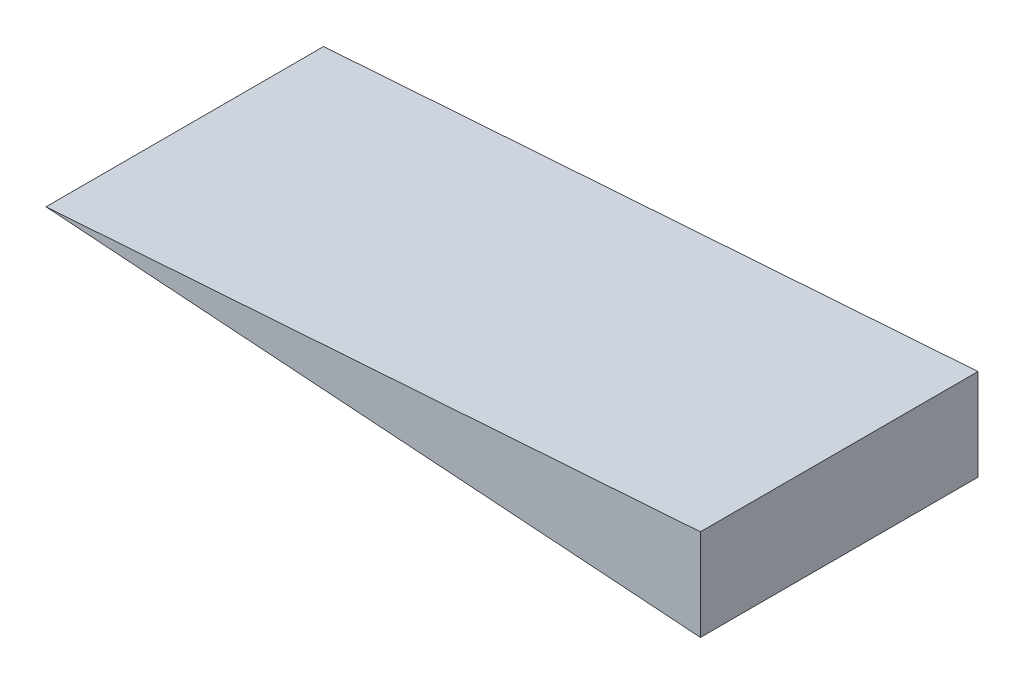
ISO-10303-21;
HEADER;
FILE_DESCRIPTION(('STEP AP214'),'2;1');
FILE_NAME('part.step','',(''),(''),'','','');
FILE_SCHEMA(('AUTOMOTIVE_DESIGN { 1 0 10303 214 1 1 1 1 }'));
ENDSEC;
DATA;
#1=APPLICATION_CONTEXT('core data for automotive mechanical design processes');
#2=APPLICATION_PROTOCOL_DEFINITION('international standard','automotive_design',2000,#1);
#3=PRODUCT_CONTEXT('',#1,'mechanical');
#4=PRODUCT('Part','Part','',(#3));
#5=PRODUCT_RELATED_PRODUCT_CATEGORY('part','',(#4));
#6=PRODUCT_DEFINITION_FORMATION('','',#4);
#7=PRODUCT_DEFINITION_CONTEXT('part definition',#1,'design');
#8=PRODUCT_DEFINITION('design','',#6,#7);
#9=PRODUCT_DEFINITION_SHAPE('','',#8);
#10=(LENGTH_UNIT() NAMED_UNIT(*) SI_UNIT(.MILLI.,.METRE.));
#11=(NAMED_UNIT(*) PLANE_ANGLE_UNIT() SI_UNIT($,.RADIAN.));
#12=(NAMED_UNIT(*) SI_UNIT($,.STERADIAN.) SOLID_ANGLE_UNIT());
#13=UNCERTAINTY_MEASURE_WITH_UNIT(LENGTH_MEASURE(1.E-05),#10,'distance_accuracy_value','');
#14=(GEOMETRIC_REPRESENTATION_CONTEXT(3) GLOBAL_UNCERTAINTY_ASSIGNED_CONTEXT((#13)) GLOBAL_UNIT_ASSIGNED_CONTEXT((#10,
#11,#12)) REPRESENTATION_CONTEXT('',''));
#15=CARTESIAN_POINT('',(0.,0.,0.));
#16=DIRECTION('',(0.,0.,1.));
#17=DIRECTION('',(1.,0.,0.));
#18=AXIS2_PLACEMENT_3D('',#15,#16,#17);
#19=CARTESIAN_POINT('',(-0.173966376200082,-2.48783508592697,0.));
#20=DIRECTION('',(0.0697564737441255,0.997564050259824,0.));
#21=DIRECTION('',(-0.997564050259824,0.0697564737441255,0.));
#22=AXIS2_PLACEMENT_3D('',#19,#20,#21);
#23=PLANE('',#22);
#24=DIRECTION('',(0.,0.,-1.));
#25=VECTOR('',#24,1.);
#26=CARTESIAN_POINT('',(200.,-16.4853623887021,50.));
#27=LINE('',#26,#25);
#28=CARTESIAN_POINT('',(200.,-16.4853623887021,50.));
#29=VERTEX_POINT('',#28);
#30=CARTESIAN_POINT('',(200.,-16.4853623887021,-50.));
#31=VERTEX_POINT('',#30);
#32=EDGE_CURVE('E76',#29,#31,#27,.T.);
#33=ORIENTED_EDGE('',*,*,#32,.F.);
#34=DIRECTION('',(0.997564050259824,-0.0697564737441255,0.));
#35=VECTOR('',#34,1.);
#36=CARTESIAN_POINT('',(200.,-16.4853623887021,50.));
#37=LINE('',#36,#35);
#38=CARTESIAN_POINT('',(-35.7516656417797,0.,50.));
#39=VERTEX_POINT('',#38);
#40=EDGE_CURVE('E68',#39,#29,#37,.T.);
#41=ORIENTED_EDGE('',*,*,#40,.F.);
#42=DIRECTION('',(0.,0.,-1.));
#43=VECTOR('',#42,1.);
#44=CARTESIAN_POINT('',(-35.7516656417798,0.,50.));
#45=LINE('',#44,#43);
#46=CARTESIAN_POINT('',(-35.7516656417797,0.,-50.));
#47=VERTEX_POINT('',#46);
#48=EDGE_CURVE('E58',#39,#47,#45,.T.);
#49=ORIENTED_EDGE('',*,*,#48,.T.);
#50=DIRECTION('',(0.997564050259824,-0.0697564737441255,0.));
#51=VECTOR('',#50,1.);
#52=CARTESIAN_POINT('',(200.,-16.4853623887021,-50.));
#53=LINE('',#52,#51);
#54=EDGE_CURVE('E42',#47,#31,#53,.T.);
#55=ORIENTED_EDGE('',*,*,#54,.T.);
#56=EDGE_LOOP('',(#33,#41,#49,#55));
#57=FACE_BOUND('',#56,.T.);
#58=ADVANCED_FACE('F39',(#57),#23,.F.);
#59=CARTESIAN_POINT('',(0.,0.,-50.));
#60=DIRECTION('',(0.,0.,1.));
#61=DIRECTION('',(1.,0.,0.));
#62=AXIS2_PLACEMENT_3D('',#59,#60,#61);
#63=PLANE('',#62);
#64=ORIENTED_EDGE('',*,*,#54,.F.);
#65=DIRECTION('',(0.997564050259824,0.0697564737441255,0.));
#66=VECTOR('',#65,1.);
#67=CARTESIAN_POINT('',(-35.7516656417797,0.,-50.));
#68=LINE('',#67,#66);
#69=CARTESIAN_POINT('',(200.,16.4853623887021,-50.));
#70=VERTEX_POINT('',#69);
#71=EDGE_CURVE('E91',#47,#70,#68,.T.);
#72=ORIENTED_EDGE('',*,*,#71,.T.);
#73=DIRECTION('',(0.,1.,0.));
#74=VECTOR('',#73,1.);
#75=CARTESIAN_POINT('',(200.,16.4853623887021,-50.));
#76=LINE('',#75,#74);
#77=EDGE_CURVE('E81',#31,#70,#76,.T.);
#78=ORIENTED_EDGE('',*,*,#77,.F.);
#79=EDGE_LOOP('',(#64,#72,#78));
#80=FACE_BOUND('',#79,.T.);
#81=ADVANCED_FACE('F90',(#80),#63,.F.);
#82=CARTESIAN_POINT('',(200.,0.,0.));
#83=DIRECTION('',(1.,0.,0.));
#84=DIRECTION('',(0.,0.,-1.));
#85=AXIS2_PLACEMENT_3D('',#82,#83,#84);
#86=PLANE('',#85);
#87=DIRECTION('',(0.,1.,0.));
#88=VECTOR('',#87,1.);
#89=CARTESIAN_POINT('',(200.,16.4853623887021,50.));
#90=LINE('',#89,#88);
#91=CARTESIAN_POINT('',(200.,16.4853623887021,50.));
#92=VERTEX_POINT('',#91);
#93=EDGE_CURVE('E83',#29,#92,#90,.T.);
#94=ORIENTED_EDGE('',*,*,#93,.F.);
#95=ORIENTED_EDGE('',*,*,#32,.T.);
#96=ORIENTED_EDGE('',*,*,#77,.T.);
#97=DIRECTION('',(0.,0.,1.));
#98=VECTOR('',#97,1.);
#99=CARTESIAN_POINT('',(200.,16.4853623887021,50.));
#100=LINE('',#99,#98);
#101=EDGE_CURVE('E49',#70,#92,#100,.T.);
#102=ORIENTED_EDGE('',*,*,#101,.T.);
#103=EDGE_LOOP('',(#94,#95,#96,#102));
#104=FACE_BOUND('',#103,.T.);
#105=ADVANCED_FACE('F78',(#104),#86,.T.);
#106=CARTESIAN_POINT('',(0.,0.,50.));
#107=DIRECTION('',(0.,0.,1.));
#108=DIRECTION('',(1.,0.,0.));
#109=AXIS2_PLACEMENT_3D('',#106,#107,#108);
#110=PLANE('',#109);
#111=ORIENTED_EDGE('',*,*,#40,.T.);
#112=ORIENTED_EDGE('',*,*,#93,.T.);
#113=DIRECTION('',(-0.997564050259824,-0.0697564737441255,0.));
#114=VECTOR('',#113,1.);
#115=CARTESIAN_POINT('',(-35.7516656417798,0.,50.));
#116=LINE('',#115,#114);
#117=EDGE_CURVE('E11',#92,#39,#116,.T.);
#118=ORIENTED_EDGE('',*,*,#117,.T.);
#119=EDGE_LOOP('',(#111,#112,#118));
#120=FACE_BOUND('',#119,.T.);
#121=ADVANCED_FACE('F149',(#120),#110,.T.);
#122=CARTESIAN_POINT('',(-0.173966376200082,2.48783508592697,0.));
#123=DIRECTION('',(0.0697564737441255,-0.997564050259824,0.));
#124=DIRECTION('',(0.997564050259824,0.0697564737441255,0.));
#125=AXIS2_PLACEMENT_3D('',#122,#123,#124);
#126=PLANE('',#125);
#127=ORIENTED_EDGE('',*,*,#48,.F.);
#128=ORIENTED_EDGE('',*,*,#117,.F.);
#129=ORIENTED_EDGE('',*,*,#101,.F.);
#130=ORIENTED_EDGE('',*,*,#71,.F.);
#131=EDGE_LOOP('',(#127,#128,#129,#130));
#132=FACE_BOUND('',#131,.T.);
#133=ADVANCED_FACE('F148',(#132),#126,.F.);
#134=CLOSED_SHELL('',(#58,#81,#105,#121,#133));
#135=MANIFOLD_SOLID_BREP('B2',#134);
#136=ADVANCED_BREP_SHAPE_REPRESENTATION('',(#18,#135),#14);
#137=SHAPE_DEFINITION_REPRESENTATION(#9,#136);
ENDSEC;
END-ISO-10303-21;
